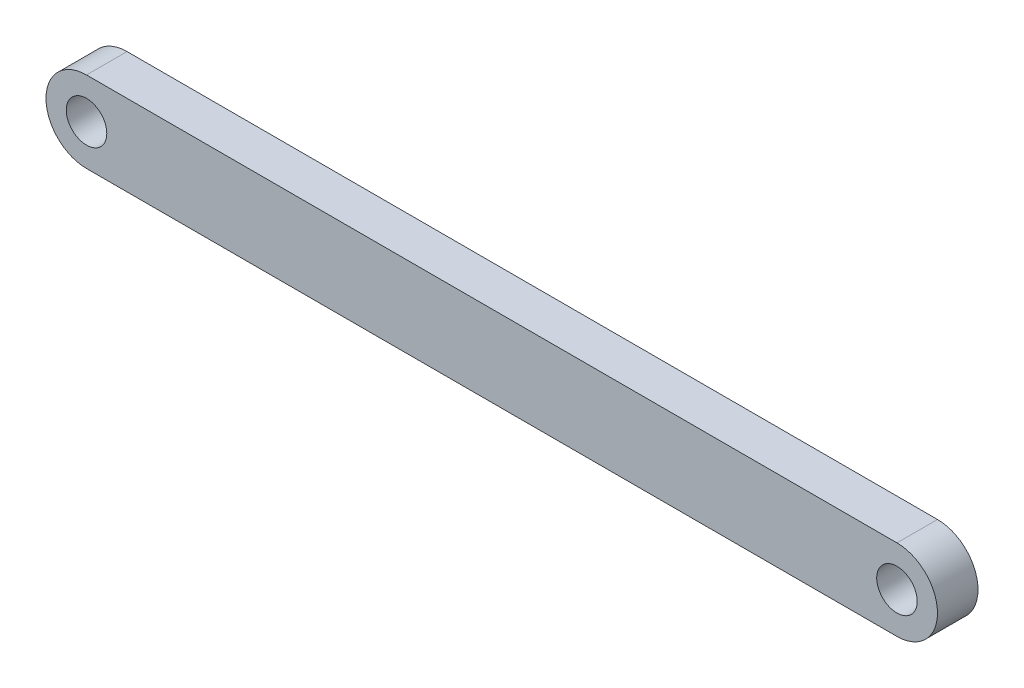
ISO-10303-21;
HEADER;
FILE_DESCRIPTION(('STEP AP214'),'2;1');
FILE_NAME('part.step','',(''),(''),'','','');
FILE_SCHEMA(('AUTOMOTIVE_DESIGN { 1 0 10303 214 1 1 1 1 }'));
ENDSEC;
DATA;
#1=APPLICATION_CONTEXT('core data for automotive mechanical design processes');
#2=APPLICATION_PROTOCOL_DEFINITION('international standard','automotive_design',2000,#1);
#3=PRODUCT_CONTEXT('',#1,'mechanical');
#4=PRODUCT('Part','Part','',(#3));
#5=PRODUCT_RELATED_PRODUCT_CATEGORY('part','',(#4));
#6=PRODUCT_DEFINITION_FORMATION('','',#4);
#7=PRODUCT_DEFINITION_CONTEXT('part definition',#1,'design');
#8=PRODUCT_DEFINITION('design','',#6,#7);
#9=PRODUCT_DEFINITION_SHAPE('','',#8);
#10=(LENGTH_UNIT() NAMED_UNIT(*) SI_UNIT(.MILLI.,.METRE.));
#11=(NAMED_UNIT(*) PLANE_ANGLE_UNIT() SI_UNIT($,.RADIAN.));
#12=(NAMED_UNIT(*) SI_UNIT($,.STERADIAN.) SOLID_ANGLE_UNIT());
#13=UNCERTAINTY_MEASURE_WITH_UNIT(LENGTH_MEASURE(1.E-05),#10,'distance_accuracy_value','');
#14=(GEOMETRIC_REPRESENTATION_CONTEXT(3) GLOBAL_UNCERTAINTY_ASSIGNED_CONTEXT((#13)) GLOBAL_UNIT_ASSIGNED_CONTEXT((#10,
#11,#12)) REPRESENTATION_CONTEXT('',''));
#15=CARTESIAN_POINT('',(0.,0.,0.));
#16=DIRECTION('',(0.,0.,1.));
#17=DIRECTION('',(1.,0.,0.));
#18=AXIS2_PLACEMENT_3D('',#15,#16,#17);
#19=CARTESIAN_POINT('',(0.,0.,5.));
#20=DIRECTION('',(0.,0.,1.));
#21=DIRECTION('',(1.,0.,0.));
#22=AXIS2_PLACEMENT_3D('',#19,#20,#21);
#23=PLANE('',#22);
#24=CARTESIAN_POINT('',(0.,0.,5.));
#25=DIRECTION('',(0.,0.,1.));
#26=DIRECTION('',(1.,0.,0.));
#27=AXIS2_PLACEMENT_3D('',#24,#25,#26);
#28=CIRCLE('',#27,2.5);
#29=CARTESIAN_POINT('',(2.5,0.,5.));
#30=VERTEX_POINT('',#29);
#31=EDGE_CURVE('E106',#30,#30,#28,.T.);
#32=ORIENTED_EDGE('',*,*,#31,.F.);
#33=EDGE_LOOP('',(#32));
#34=FACE_BOUND('',#33,.T.);
#35=CARTESIAN_POINT('',(0.,0.,5.));
#36=DIRECTION('',(0.,0.,1.));
#37=DIRECTION('',(1.,0.,0.));
#38=AXIS2_PLACEMENT_3D('',#35,#36,#37);
#39=CIRCLE('',#38,5.);
#40=CARTESIAN_POINT('',(0.,5.,5.));
#41=VERTEX_POINT('',#40);
#42=CARTESIAN_POINT('',(0.,-5.,5.));
#43=VERTEX_POINT('',#42);
#44=EDGE_CURVE('E91',#41,#43,#39,.T.);
#45=ORIENTED_EDGE('',*,*,#44,.T.);
#46=DIRECTION('',(1.,0.,0.));
#47=VECTOR('',#46,1.);
#48=CARTESIAN_POINT('',(0.,-5.,5.));
#49=LINE('',#48,#47);
#50=CARTESIAN_POINT('',(100.,-5.,5.));
#51=VERTEX_POINT('',#50);
#52=EDGE_CURVE('E86',#43,#51,#49,.T.);
#53=ORIENTED_EDGE('',*,*,#52,.T.);
#54=CARTESIAN_POINT('',(100.,0.,5.));
#55=DIRECTION('',(0.,0.,1.));
#56=DIRECTION('',(1.,0.,0.));
#57=AXIS2_PLACEMENT_3D('',#54,#55,#56);
#58=CIRCLE('',#57,5.);
#59=CARTESIAN_POINT('',(100.,5.,5.));
#60=VERTEX_POINT('',#59);
#61=EDGE_CURVE('E89',#51,#60,#58,.T.);
#62=ORIENTED_EDGE('',*,*,#61,.T.);
#63=DIRECTION('',(-1.,0.,0.));
#64=VECTOR('',#63,1.);
#65=CARTESIAN_POINT('',(0.,5.,5.));
#66=LINE('',#65,#64);
#67=EDGE_CURVE('E56',#60,#41,#66,.T.);
#68=ORIENTED_EDGE('',*,*,#67,.T.);
#69=EDGE_LOOP('',(#45,#53,#62,#68));
#70=FACE_BOUND('',#69,.T.);
#71=CARTESIAN_POINT('',(100.,0.,5.));
#72=DIRECTION('',(0.,0.,1.));
#73=DIRECTION('',(1.,0.,0.));
#74=AXIS2_PLACEMENT_3D('',#71,#72,#73);
#75=CIRCLE('',#74,2.5);
#76=CARTESIAN_POINT('',(102.5,0.,5.));
#77=VERTEX_POINT('',#76);
#78=EDGE_CURVE('E121',#77,#77,#75,.T.);
#79=ORIENTED_EDGE('',*,*,#78,.F.);
#80=EDGE_LOOP('',(#79));
#81=FACE_BOUND('',#80,.T.);
#82=ADVANCED_FACE('F39',(#34,#70,#81),#23,.T.);
#83=CARTESIAN_POINT('',(0.,0.,5.));
#84=DIRECTION('',(0.,0.,-1.));
#85=DIRECTION('',(-1.,0.,0.));
#86=AXIS2_PLACEMENT_3D('',#83,#84,#85);
#87=CYLINDRICAL_SURFACE('',#86,5.);
#88=CARTESIAN_POINT('',(0.,0.,0.));
#89=DIRECTION('',(0.,0.,1.));
#90=DIRECTION('',(1.,0.,0.));
#91=AXIS2_PLACEMENT_3D('',#88,#89,#90);
#92=CIRCLE('',#91,5.);
#93=CARTESIAN_POINT('',(0.,5.,0.));
#94=VERTEX_POINT('',#93);
#95=CARTESIAN_POINT('',(0.,-5.,0.));
#96=VERTEX_POINT('',#95);
#97=EDGE_CURVE('E103',#94,#96,#92,.T.);
#98=ORIENTED_EDGE('',*,*,#97,.T.);
#99=DIRECTION('',(0.,0.,-1.));
#100=VECTOR('',#99,1.);
#101=CARTESIAN_POINT('',(0.,-5.,5.));
#102=LINE('',#101,#100);
#103=EDGE_CURVE('E11',#43,#96,#102,.T.);
#104=ORIENTED_EDGE('',*,*,#103,.F.);
#105=ORIENTED_EDGE('',*,*,#44,.F.);
#106=DIRECTION('',(0.,0.,-1.));
#107=VECTOR('',#106,1.);
#108=CARTESIAN_POINT('',(0.,5.,5.));
#109=LINE('',#108,#107);
#110=EDGE_CURVE('E99',#41,#94,#109,.T.);
#111=ORIENTED_EDGE('',*,*,#110,.T.);
#112=EDGE_LOOP('',(#98,#104,#105,#111));
#113=FACE_BOUND('',#112,.T.);
#114=ADVANCED_FACE('F41',(#113),#87,.T.);
#115=CARTESIAN_POINT('',(0.,-5.,5.));
#116=DIRECTION('',(0.,1.,0.));
#117=DIRECTION('',(0.,0.,1.));
#118=AXIS2_PLACEMENT_3D('',#115,#116,#117);
#119=PLANE('',#118);
#120=DIRECTION('',(1.,0.,0.));
#121=VECTOR('',#120,1.);
#122=CARTESIAN_POINT('',(0.,-5.,0.));
#123=LINE('',#122,#121);
#124=CARTESIAN_POINT('',(100.,-5.,0.));
#125=VERTEX_POINT('',#124);
#126=EDGE_CURVE('E95',#96,#125,#123,.T.);
#127=ORIENTED_EDGE('',*,*,#126,.T.);
#128=DIRECTION('',(0.,0.,-1.));
#129=VECTOR('',#128,1.);
#130=CARTESIAN_POINT('',(100.,-5.,5.));
#131=LINE('',#130,#129);
#132=EDGE_CURVE('E48',#51,#125,#131,.T.);
#133=ORIENTED_EDGE('',*,*,#132,.F.);
#134=ORIENTED_EDGE('',*,*,#52,.F.);
#135=ORIENTED_EDGE('',*,*,#103,.T.);
#136=EDGE_LOOP('',(#127,#133,#134,#135));
#137=FACE_BOUND('',#136,.T.);
#138=ADVANCED_FACE('F94',(#137),#119,.F.);
#139=CARTESIAN_POINT('',(100.,0.,5.));
#140=DIRECTION('',(0.,0.,-1.));
#141=DIRECTION('',(-1.,0.,0.));
#142=AXIS2_PLACEMENT_3D('',#139,#140,#141);
#143=CYLINDRICAL_SURFACE('',#142,5.);
#144=CARTESIAN_POINT('',(100.,0.,0.));
#145=DIRECTION('',(0.,0.,1.));
#146=DIRECTION('',(1.,0.,0.));
#147=AXIS2_PLACEMENT_3D('',#144,#145,#146);
#148=CIRCLE('',#147,5.);
#149=CARTESIAN_POINT('',(100.,5.,0.));
#150=VERTEX_POINT('',#149);
#151=EDGE_CURVE('E73',#125,#150,#148,.T.);
#152=ORIENTED_EDGE('',*,*,#151,.T.);
#153=DIRECTION('',(0.,0.,-1.));
#154=VECTOR('',#153,1.);
#155=CARTESIAN_POINT('',(100.,5.,5.));
#156=LINE('',#155,#154);
#157=EDGE_CURVE('E96',#60,#150,#156,.T.);
#158=ORIENTED_EDGE('',*,*,#157,.F.);
#159=ORIENTED_EDGE('',*,*,#61,.F.);
#160=ORIENTED_EDGE('',*,*,#132,.T.);
#161=EDGE_LOOP('',(#152,#158,#159,#160));
#162=FACE_BOUND('',#161,.T.);
#163=ADVANCED_FACE('F97',(#162),#143,.T.);
#164=CARTESIAN_POINT('',(0.,5.,5.));
#165=DIRECTION('',(0.,-1.,0.));
#166=DIRECTION('',(0.,0.,-1.));
#167=AXIS2_PLACEMENT_3D('',#164,#165,#166);
#168=PLANE('',#167);
#169=DIRECTION('',(-1.,0.,0.));
#170=VECTOR('',#169,1.);
#171=CARTESIAN_POINT('',(0.,5.,0.));
#172=LINE('',#171,#170);
#173=EDGE_CURVE('E79',#150,#94,#172,.T.);
#174=ORIENTED_EDGE('',*,*,#173,.T.);
#175=ORIENTED_EDGE('',*,*,#110,.F.);
#176=ORIENTED_EDGE('',*,*,#67,.F.);
#177=ORIENTED_EDGE('',*,*,#157,.T.);
#178=EDGE_LOOP('',(#174,#175,#176,#177));
#179=FACE_BOUND('',#178,.T.);
#180=ADVANCED_FACE('F111',(#179),#168,.F.);
#181=CARTESIAN_POINT('',(0.,0.,5.));
#182=DIRECTION('',(0.,0.,-1.));
#183=DIRECTION('',(-1.,0.,0.));
#184=AXIS2_PLACEMENT_3D('',#181,#182,#183);
#185=CYLINDRICAL_SURFACE('',#184,2.5);
#186=ORIENTED_EDGE('',*,*,#31,.T.);
#187=EDGE_LOOP('',(#186));
#188=FACE_BOUND('',#187,.T.);
#189=CARTESIAN_POINT('',(0.,0.,0.));
#190=DIRECTION('',(0.,0.,1.));
#191=DIRECTION('',(1.,0.,0.));
#192=AXIS2_PLACEMENT_3D('',#189,#190,#191);
#193=CIRCLE('',#192,2.5);
#194=CARTESIAN_POINT('',(2.5,0.,0.));
#195=VERTEX_POINT('',#194);
#196=EDGE_CURVE('E118',#195,#195,#193,.T.);
#197=ORIENTED_EDGE('',*,*,#196,.F.);
#198=EDGE_LOOP('',(#197));
#199=FACE_BOUND('',#198,.T.);
#200=ADVANCED_FACE('F145',(#188,#199),#185,.F.);
#201=CARTESIAN_POINT('',(100.,0.,5.));
#202=DIRECTION('',(0.,0.,-1.));
#203=DIRECTION('',(-1.,0.,0.));
#204=AXIS2_PLACEMENT_3D('',#201,#202,#203);
#205=CYLINDRICAL_SURFACE('',#204,2.5);
#206=ORIENTED_EDGE('',*,*,#78,.T.);
#207=EDGE_LOOP('',(#206));
#208=FACE_BOUND('',#207,.T.);
#209=CARTESIAN_POINT('',(100.,0.,0.));
#210=DIRECTION('',(0.,0.,1.));
#211=DIRECTION('',(1.,0.,0.));
#212=AXIS2_PLACEMENT_3D('',#209,#210,#211);
#213=CIRCLE('',#212,2.5);
#214=CARTESIAN_POINT('',(102.5,0.,0.));
#215=VERTEX_POINT('',#214);
#216=EDGE_CURVE('E124',#215,#215,#213,.T.);
#217=ORIENTED_EDGE('',*,*,#216,.F.);
#218=EDGE_LOOP('',(#217));
#219=FACE_BOUND('',#218,.T.);
#220=ADVANCED_FACE('F130',(#208,#219),#205,.F.);
#221=CARTESIAN_POINT('',(0.,0.,0.));
#222=DIRECTION('',(0.,0.,1.));
#223=DIRECTION('',(1.,0.,0.));
#224=AXIS2_PLACEMENT_3D('',#221,#222,#223);
#225=PLANE('',#224);
#226=ORIENTED_EDGE('',*,*,#97,.F.);
#227=ORIENTED_EDGE('',*,*,#173,.F.);
#228=ORIENTED_EDGE('',*,*,#151,.F.);
#229=ORIENTED_EDGE('',*,*,#126,.F.);
#230=EDGE_LOOP('',(#226,#227,#228,#229));
#231=FACE_BOUND('',#230,.T.);
#232=ORIENTED_EDGE('',*,*,#196,.T.);
#233=EDGE_LOOP('',(#232));
#234=FACE_BOUND('',#233,.T.);
#235=ORIENTED_EDGE('',*,*,#216,.T.);
#236=EDGE_LOOP('',(#235));
#237=FACE_BOUND('',#236,.T.);
#238=ADVANCED_FACE('F114',(#231,#234,#237),#225,.F.);
#239=CLOSED_SHELL('',(#82,#114,#138,#163,#180,#200,#220,#238));
#240=MANIFOLD_SOLID_BREP('B2',#239);
#241=ADVANCED_BREP_SHAPE_REPRESENTATION('',(#18,#240),#14);
#242=SHAPE_DEFINITION_REPRESENTATION(#9,#241);
ENDSEC;
END-ISO-10303-21;
